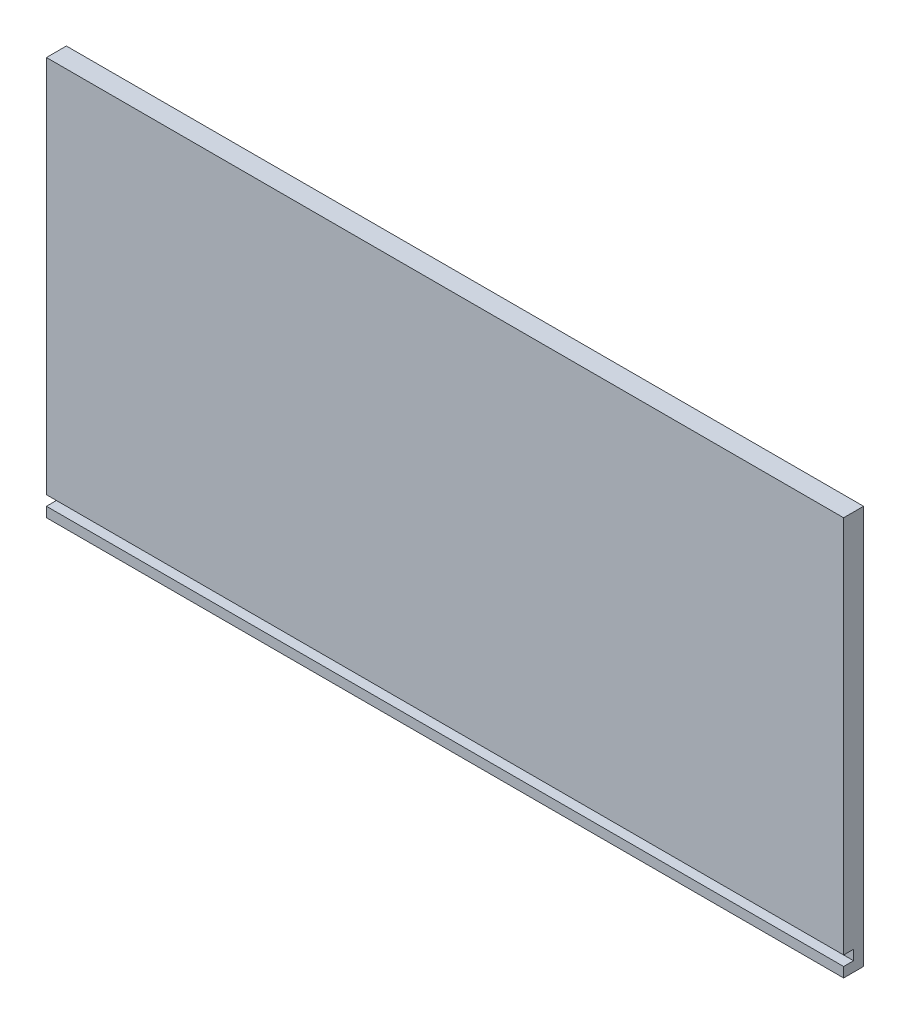
ISO-10303-21;
HEADER;
FILE_DESCRIPTION(('STEP AP214'),'2;1');
FILE_NAME('part.step','',(''),(''),'','','');
FILE_SCHEMA(('AUTOMOTIVE_DESIGN { 1 0 10303 214 1 1 1 1 }'));
ENDSEC;
DATA;
#1=APPLICATION_CONTEXT('core data for automotive mechanical design processes');
#2=APPLICATION_PROTOCOL_DEFINITION('international standard','automotive_design',2000,#1);
#3=PRODUCT_CONTEXT('',#1,'mechanical');
#4=PRODUCT('Part','Part','',(#3));
#5=PRODUCT_RELATED_PRODUCT_CATEGORY('part','',(#4));
#6=PRODUCT_DEFINITION_FORMATION('','',#4);
#7=PRODUCT_DEFINITION_CONTEXT('part definition',#1,'design');
#8=PRODUCT_DEFINITION('design','',#6,#7);
#9=PRODUCT_DEFINITION_SHAPE('','',#8);
#10=(LENGTH_UNIT() NAMED_UNIT(*) SI_UNIT(.MILLI.,.METRE.));
#11=(NAMED_UNIT(*) PLANE_ANGLE_UNIT() SI_UNIT($,.RADIAN.));
#12=(NAMED_UNIT(*) SI_UNIT($,.STERADIAN.) SOLID_ANGLE_UNIT());
#13=UNCERTAINTY_MEASURE_WITH_UNIT(LENGTH_MEASURE(1.E-05),#10,'distance_accuracy_value','');
#14=(GEOMETRIC_REPRESENTATION_CONTEXT(3) GLOBAL_UNCERTAINTY_ASSIGNED_CONTEXT((#13)) GLOBAL_UNIT_ASSIGNED_CONTEXT((#10,
#11,#12)) REPRESENTATION_CONTEXT('',''));
#15=CARTESIAN_POINT('',(0.,0.,0.));
#16=DIRECTION('',(0.,0.,1.));
#17=DIRECTION('',(1.,0.,0.));
#18=AXIS2_PLACEMENT_3D('',#15,#16,#17);
#19=CARTESIAN_POINT('',(0.,0.,10.));
#20=DIRECTION('',(0.,0.,1.));
#21=DIRECTION('',(1.,0.,0.));
#22=AXIS2_PLACEMENT_3D('',#19,#20,#21);
#23=PLANE('',#22);
#24=DIRECTION('',(1.,0.,0.));
#25=VECTOR('',#24,1.);
#26=CARTESIAN_POINT('',(330.719868276619,-33.4928571428572,10.));
#27=LINE('',#26,#25);
#28=CARTESIAN_POINT('',(-69.2801317233809,-33.4928571428572,10.));
#29=VERTEX_POINT('',#28);
#30=CARTESIAN_POINT('',(330.719868276619,-33.4928571428572,10.));
#31=VERTEX_POINT('',#30);
#32=EDGE_CURVE('E126',#29,#31,#27,.T.);
#33=ORIENTED_EDGE('',*,*,#32,.F.);
#34=DIRECTION('',(0.,-1.,0.));
#35=VECTOR('',#34,1.);
#36=CARTESIAN_POINT('',(-69.2801317233809,161.507142857143,10.));
#37=LINE('',#36,#35);
#38=CARTESIAN_POINT('',(-69.2801317233809,-38.4928571428571,10.));
#39=VERTEX_POINT('',#38);
#40=EDGE_CURVE('E88',#29,#39,#37,.T.);
#41=ORIENTED_EDGE('',*,*,#40,.T.);
#42=DIRECTION('',(1.,0.,0.));
#43=VECTOR('',#42,1.);
#44=CARTESIAN_POINT('',(-69.2801317233809,-38.4928571428571,10.));
#45=LINE('',#44,#43);
#46=CARTESIAN_POINT('',(330.719868276619,-38.4928571428571,10.));
#47=VERTEX_POINT('',#46);
#48=EDGE_CURVE('E140',#39,#47,#45,.T.);
#49=ORIENTED_EDGE('',*,*,#48,.T.);
#50=DIRECTION('',(0.,1.,0.));
#51=VECTOR('',#50,1.);
#52=CARTESIAN_POINT('',(330.719868276619,161.507142857143,10.));
#53=LINE('',#52,#51);
#54=EDGE_CURVE('E142',#47,#31,#53,.T.);
#55=ORIENTED_EDGE('',*,*,#54,.T.);
#56=EDGE_LOOP('',(#33,#41,#49,#55));
#57=FACE_BOUND('',#56,.T.);
#58=ADVANCED_FACE('F35',(#57),#23,.T.);
#59=CARTESIAN_POINT('',(-69.2801317233809,161.507142857143,10.));
#60=DIRECTION('',(1.,0.,0.));
#61=DIRECTION('',(0.,1.,0.));
#62=AXIS2_PLACEMENT_3D('',#59,#60,#61);
#63=PLANE('',#62);
#64=ORIENTED_EDGE('',*,*,#40,.F.);
#65=DIRECTION('',(0.,0.,1.));
#66=VECTOR('',#65,1.);
#67=CARTESIAN_POINT('',(-69.2801317233809,-33.4928571428572,5.));
#68=LINE('',#67,#66);
#69=CARTESIAN_POINT('',(-69.2801317233809,-33.4928571428572,5.));
#70=VERTEX_POINT('',#69);
#71=EDGE_CURVE('E133',#70,#29,#68,.T.);
#72=ORIENTED_EDGE('',*,*,#71,.F.);
#73=DIRECTION('',(0.,-1.,0.));
#74=VECTOR('',#73,1.);
#75=CARTESIAN_POINT('',(-69.2801317233809,-33.4928571428572,5.));
#76=LINE('',#75,#74);
#77=CARTESIAN_POINT('',(-69.2801317233809,-28.4928571428572,5.));
#78=VERTEX_POINT('',#77);
#79=EDGE_CURVE('E116',#78,#70,#76,.T.);
#80=ORIENTED_EDGE('',*,*,#79,.F.);
#81=DIRECTION('',(0.,0.,1.));
#82=VECTOR('',#81,1.);
#83=CARTESIAN_POINT('',(-69.2801317233809,-28.4928571428572,5.));
#84=LINE('',#83,#82);
#85=CARTESIAN_POINT('',(-69.2801317233809,-28.4928571428572,10.));
#86=VERTEX_POINT('',#85);
#87=EDGE_CURVE('E113',#78,#86,#84,.T.);
#88=ORIENTED_EDGE('',*,*,#87,.T.);
#89=CARTESIAN_POINT('',(-69.2801317233809,161.507142857143,10.));
#90=VERTEX_POINT('',#89);
#91=EDGE_CURVE('E138',#90,#86,#37,.T.);
#92=ORIENTED_EDGE('',*,*,#91,.F.);
#93=DIRECTION('',(0.,0.,-1.));
#94=VECTOR('',#93,1.);
#95=CARTESIAN_POINT('',(-69.2801317233809,161.507142857143,10.));
#96=LINE('',#95,#94);
#97=CARTESIAN_POINT('',(-69.2801317233809,161.507142857143,0.));
#98=VERTEX_POINT('',#97);
#99=EDGE_CURVE('E146',#90,#98,#96,.T.);
#100=ORIENTED_EDGE('',*,*,#99,.T.);
#101=DIRECTION('',(0.,-1.,0.));
#102=VECTOR('',#101,1.);
#103=CARTESIAN_POINT('',(-69.2801317233809,161.507142857143,0.));
#104=LINE('',#103,#102);
#105=CARTESIAN_POINT('',(-69.2801317233809,-38.4928571428571,0.));
#106=VERTEX_POINT('',#105);
#107=EDGE_CURVE('E147',#98,#106,#104,.T.);
#108=ORIENTED_EDGE('',*,*,#107,.T.);
#109=DIRECTION('',(0.,0.,-1.));
#110=VECTOR('',#109,1.);
#111=CARTESIAN_POINT('',(-69.2801317233809,-38.4928571428571,10.));
#112=LINE('',#111,#110);
#113=EDGE_CURVE('E11',#39,#106,#112,.T.);
#114=ORIENTED_EDGE('',*,*,#113,.F.);
#115=EDGE_LOOP('',(#64,#72,#80,#88,#92,#100,#108,#114));
#116=FACE_BOUND('',#115,.T.);
#117=ADVANCED_FACE('F37',(#116),#63,.F.);
#118=CARTESIAN_POINT('',(-69.2801317233809,-38.4928571428571,10.));
#119=DIRECTION('',(0.,1.,0.));
#120=DIRECTION('',(0.,0.,1.));
#121=AXIS2_PLACEMENT_3D('',#118,#119,#120);
#122=PLANE('',#121);
#123=DIRECTION('',(1.,0.,0.));
#124=VECTOR('',#123,1.);
#125=CARTESIAN_POINT('',(-69.2801317233809,-38.4928571428571,0.));
#126=LINE('',#125,#124);
#127=CARTESIAN_POINT('',(330.719868276619,-38.4928571428571,0.));
#128=VERTEX_POINT('',#127);
#129=EDGE_CURVE('E150',#106,#128,#126,.T.);
#130=ORIENTED_EDGE('',*,*,#129,.T.);
#131=DIRECTION('',(0.,0.,-1.));
#132=VECTOR('',#131,1.);
#133=CARTESIAN_POINT('',(330.719868276619,-38.4928571428571,10.));
#134=LINE('',#133,#132);
#135=EDGE_CURVE('E43',#47,#128,#134,.T.);
#136=ORIENTED_EDGE('',*,*,#135,.F.);
#137=ORIENTED_EDGE('',*,*,#48,.F.);
#138=ORIENTED_EDGE('',*,*,#113,.T.);
#139=EDGE_LOOP('',(#130,#136,#137,#138));
#140=FACE_BOUND('',#139,.T.);
#141=ADVANCED_FACE('F180',(#140),#122,.F.);
#142=CARTESIAN_POINT('',(330.719868276619,161.507142857143,10.));
#143=DIRECTION('',(-1.,0.,0.));
#144=DIRECTION('',(0.,0.,1.));
#145=AXIS2_PLACEMENT_3D('',#142,#143,#144);
#146=PLANE('',#145);
#147=DIRECTION('',(0.,1.,0.));
#148=VECTOR('',#147,1.);
#149=CARTESIAN_POINT('',(330.719868276619,-33.4928571428572,5.));
#150=LINE('',#149,#148);
#151=CARTESIAN_POINT('',(330.719868276619,-33.4928571428572,5.));
#152=VERTEX_POINT('',#151);
#153=CARTESIAN_POINT('',(330.719868276619,-28.4928571428572,5.));
#154=VERTEX_POINT('',#153);
#155=EDGE_CURVE('E117',#152,#154,#150,.T.);
#156=ORIENTED_EDGE('',*,*,#155,.F.);
#157=DIRECTION('',(0.,0.,1.));
#158=VECTOR('',#157,1.);
#159=CARTESIAN_POINT('',(330.719868276619,-33.4928571428572,5.));
#160=LINE('',#159,#158);
#161=EDGE_CURVE('E151',#152,#31,#160,.T.);
#162=ORIENTED_EDGE('',*,*,#161,.T.);
#163=ORIENTED_EDGE('',*,*,#54,.F.);
#164=ORIENTED_EDGE('',*,*,#135,.T.);
#165=DIRECTION('',(0.,1.,0.));
#166=VECTOR('',#165,1.);
#167=CARTESIAN_POINT('',(330.719868276619,161.507142857143,0.));
#168=LINE('',#167,#166);
#169=CARTESIAN_POINT('',(330.719868276619,161.507142857143,0.));
#170=VERTEX_POINT('',#169);
#171=EDGE_CURVE('E153',#128,#170,#168,.T.);
#172=ORIENTED_EDGE('',*,*,#171,.T.);
#173=DIRECTION('',(0.,0.,-1.));
#174=VECTOR('',#173,1.);
#175=CARTESIAN_POINT('',(330.719868276619,161.507142857143,10.));
#176=LINE('',#175,#174);
#177=CARTESIAN_POINT('',(330.719868276619,161.507142857143,10.));
#178=VERTEX_POINT('',#177);
#179=EDGE_CURVE('E157',#178,#170,#176,.T.);
#180=ORIENTED_EDGE('',*,*,#179,.F.);
#181=CARTESIAN_POINT('',(330.719868276619,-28.4928571428572,10.));
#182=VERTEX_POINT('',#181);
#183=EDGE_CURVE('E131',#182,#178,#53,.T.);
#184=ORIENTED_EDGE('',*,*,#183,.F.);
#185=DIRECTION('',(0.,0.,1.));
#186=VECTOR('',#185,1.);
#187=CARTESIAN_POINT('',(330.719868276619,-28.4928571428572,5.));
#188=LINE('',#187,#186);
#189=EDGE_CURVE('E50',#154,#182,#188,.T.);
#190=ORIENTED_EDGE('',*,*,#189,.F.);
#191=EDGE_LOOP('',(#156,#162,#163,#164,#172,#180,#184,#190));
#192=FACE_BOUND('',#191,.T.);
#193=ADVANCED_FACE('F129',(#192),#146,.F.);
#194=CARTESIAN_POINT('',(-69.2801317233809,161.507142857143,10.));
#195=DIRECTION('',(0.,-1.,0.));
#196=DIRECTION('',(0.,0.,-1.));
#197=AXIS2_PLACEMENT_3D('',#194,#195,#196);
#198=PLANE('',#197);
#199=DIRECTION('',(-1.,0.,0.));
#200=VECTOR('',#199,1.);
#201=CARTESIAN_POINT('',(-69.2801317233809,161.507142857143,0.));
#202=LINE('',#201,#200);
#203=EDGE_CURVE('E80',#170,#98,#202,.T.);
#204=ORIENTED_EDGE('',*,*,#203,.T.);
#205=ORIENTED_EDGE('',*,*,#99,.F.);
#206=DIRECTION('',(-1.,0.,0.));
#207=VECTOR('',#206,1.);
#208=CARTESIAN_POINT('',(-69.2801317233809,161.507142857143,10.));
#209=LINE('',#208,#207);
#210=EDGE_CURVE('E59',#178,#90,#209,.T.);
#211=ORIENTED_EDGE('',*,*,#210,.F.);
#212=ORIENTED_EDGE('',*,*,#179,.T.);
#213=EDGE_LOOP('',(#204,#205,#211,#212));
#214=FACE_BOUND('',#213,.T.);
#215=ADVANCED_FACE('F169',(#214),#198,.F.);
#216=DIRECTION('',(-1.,0.,0.));
#217=VECTOR('',#216,1.);
#218=CARTESIAN_POINT('',(330.719868276619,-28.4928571428572,10.));
#219=LINE('',#218,#217);
#220=EDGE_CURVE('E249',#182,#86,#219,.T.);
#221=ORIENTED_EDGE('',*,*,#220,.F.);
#222=ORIENTED_EDGE('',*,*,#183,.T.);
#223=ORIENTED_EDGE('',*,*,#210,.T.);
#224=ORIENTED_EDGE('',*,*,#91,.T.);
#225=EDGE_LOOP('',(#221,#222,#223,#224));
#226=FACE_BOUND('',#225,.T.);
#227=ADVANCED_FACE('F171',(#226),#23,.T.);
#228=CARTESIAN_POINT('',(0.,0.,0.));
#229=DIRECTION('',(0.,0.,1.));
#230=DIRECTION('',(1.,0.,0.));
#231=AXIS2_PLACEMENT_3D('',#228,#229,#230);
#232=PLANE('',#231);
#233=ORIENTED_EDGE('',*,*,#107,.F.);
#234=ORIENTED_EDGE('',*,*,#203,.F.);
#235=ORIENTED_EDGE('',*,*,#171,.F.);
#236=ORIENTED_EDGE('',*,*,#129,.F.);
#237=EDGE_LOOP('',(#233,#234,#235,#236));
#238=FACE_BOUND('',#237,.T.);
#239=ADVANCED_FACE('F165',(#238),#232,.F.);
#240=CARTESIAN_POINT('',(330.719868276619,-33.4928571428572,5.));
#241=DIRECTION('',(0.,-1.,0.));
#242=DIRECTION('',(1.,0.,0.));
#243=AXIS2_PLACEMENT_3D('',#240,#241,#242);
#244=PLANE('',#243);
#245=ORIENTED_EDGE('',*,*,#32,.T.);
#246=ORIENTED_EDGE('',*,*,#161,.F.);
#247=DIRECTION('',(1.,0.,0.));
#248=VECTOR('',#247,1.);
#249=CARTESIAN_POINT('',(330.719868276619,-33.4928571428572,5.));
#250=LINE('',#249,#248);
#251=EDGE_CURVE('E123',#70,#152,#250,.T.);
#252=ORIENTED_EDGE('',*,*,#251,.F.);
#253=ORIENTED_EDGE('',*,*,#71,.T.);
#254=EDGE_LOOP('',(#245,#246,#252,#253));
#255=FACE_BOUND('',#254,.T.);
#256=ADVANCED_FACE('F191',(#255),#244,.F.);
#257=CARTESIAN_POINT('',(330.719868276619,-28.4928571428572,5.));
#258=DIRECTION('',(0.,1.,0.));
#259=DIRECTION('',(-1.,0.,0.));
#260=AXIS2_PLACEMENT_3D('',#257,#258,#259);
#261=PLANE('',#260);
#262=ORIENTED_EDGE('',*,*,#220,.T.);
#263=ORIENTED_EDGE('',*,*,#87,.F.);
#264=DIRECTION('',(-1.,0.,0.));
#265=VECTOR('',#264,1.);
#266=CARTESIAN_POINT('',(330.719868276619,-28.4928571428572,5.));
#267=LINE('',#266,#265);
#268=EDGE_CURVE('E109',#154,#78,#267,.T.);
#269=ORIENTED_EDGE('',*,*,#268,.F.);
#270=ORIENTED_EDGE('',*,*,#189,.T.);
#271=EDGE_LOOP('',(#262,#263,#269,#270));
#272=FACE_BOUND('',#271,.T.);
#273=ADVANCED_FACE('F111',(#272),#261,.F.);
#274=CARTESIAN_POINT('',(0.,0.,5.));
#275=DIRECTION('',(0.,0.,1.));
#276=DIRECTION('',(1.,0.,0.));
#277=AXIS2_PLACEMENT_3D('',#274,#275,#276);
#278=PLANE('',#277);
#279=ORIENTED_EDGE('',*,*,#155,.T.);
#280=ORIENTED_EDGE('',*,*,#268,.T.);
#281=ORIENTED_EDGE('',*,*,#79,.T.);
#282=ORIENTED_EDGE('',*,*,#251,.T.);
#283=EDGE_LOOP('',(#279,#280,#281,#282));
#284=FACE_BOUND('',#283,.T.);
#285=ADVANCED_FACE('F121',(#284),#278,.T.);
#286=CLOSED_SHELL('',(#58,#117,#141,#193,#215,#227,#239,#256,#273,#285));
#287=MANIFOLD_SOLID_BREP('B2',#286);
#288=ADVANCED_BREP_SHAPE_REPRESENTATION('',(#18,#287),#14);
#289=SHAPE_DEFINITION_REPRESENTATION(#9,#288);
ENDSEC;
END-ISO-10303-21;
